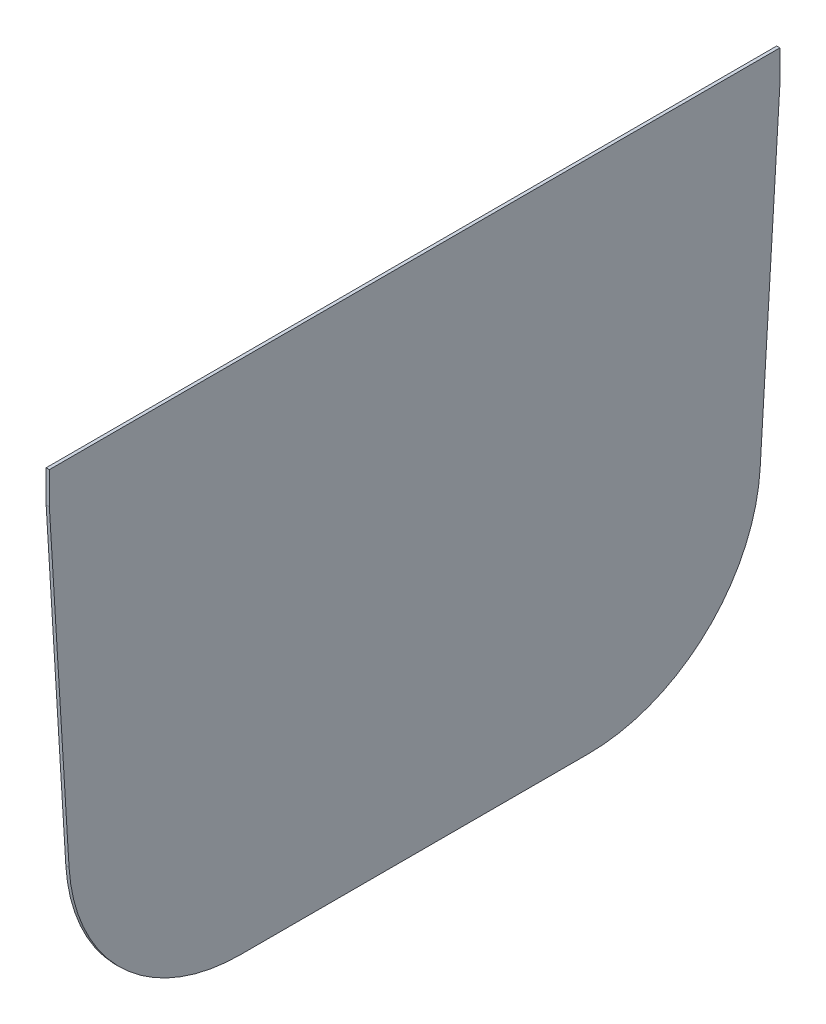
ISO-10303-21;
HEADER;
FILE_DESCRIPTION(('STEP AP214'),'2;1');
FILE_NAME('part.step','',(''),(''),'','','');
FILE_SCHEMA(('AUTOMOTIVE_DESIGN { 1 0 10303 214 1 1 1 1 }'));
ENDSEC;
DATA;
#1=APPLICATION_CONTEXT('core data for automotive mechanical design processes');
#2=APPLICATION_PROTOCOL_DEFINITION('international standard','automotive_design',2000,#1);
#3=PRODUCT_CONTEXT('',#1,'mechanical');
#4=PRODUCT('Part','Part','',(#3));
#5=PRODUCT_RELATED_PRODUCT_CATEGORY('part','',(#4));
#6=PRODUCT_DEFINITION_FORMATION('','',#4);
#7=PRODUCT_DEFINITION_CONTEXT('part definition',#1,'design');
#8=PRODUCT_DEFINITION('design','',#6,#7);
#9=PRODUCT_DEFINITION_SHAPE('','',#8);
#10=(LENGTH_UNIT() NAMED_UNIT(*) SI_UNIT(.MILLI.,.METRE.));
#11=(NAMED_UNIT(*) PLANE_ANGLE_UNIT() SI_UNIT($,.RADIAN.));
#12=(NAMED_UNIT(*) SI_UNIT($,.STERADIAN.) SOLID_ANGLE_UNIT());
#13=UNCERTAINTY_MEASURE_WITH_UNIT(LENGTH_MEASURE(1.E-05),#10,'distance_accuracy_value','');
#14=(GEOMETRIC_REPRESENTATION_CONTEXT(3) GLOBAL_UNCERTAINTY_ASSIGNED_CONTEXT((#13)) GLOBAL_UNIT_ASSIGNED_CONTEXT((#10,
#11,#12)) REPRESENTATION_CONTEXT('',''));
#15=CARTESIAN_POINT('',(0.,0.,0.));
#16=DIRECTION('',(0.,0.,1.));
#17=DIRECTION('',(1.,0.,0.));
#18=AXIS2_PLACEMENT_3D('',#15,#16,#17);
#19=CARTESIAN_POINT('',(1.5,-149.998844119243,-109.248974344511));
#20=DIRECTION('',(-1.,0.,0.));
#21=DIRECTION('',(0.,0.,1.));
#22=AXIS2_PLACEMENT_3D('',#19,#20,#21);
#23=CYLINDRICAL_SURFACE('',#22,80.);
#24=CARTESIAN_POINT('',(0.,-149.998844119243,-109.248974344511));
#25=DIRECTION('',(1.,0.,0.));
#26=DIRECTION('',(0.,0.,-1.));
#27=AXIS2_PLACEMENT_3D('',#24,#25,#26);
#28=CIRCLE('',#27,80.);
#29=CARTESIAN_POINT('',(0.,-154.882727282031,-29.3981904707621));
#30=VERTEX_POINT('',#29);
#31=CARTESIAN_POINT('',(0.,-229.998844119243,-109.248974344511));
#32=VERTEX_POINT('',#31);
#33=EDGE_CURVE('E204',#30,#32,#28,.T.);
#34=ORIENTED_EDGE('',*,*,#33,.T.);
#35=DIRECTION('',(-1.,0.,0.));
#36=VECTOR('',#35,1.);
#37=CARTESIAN_POINT('',(1.5,-229.998844119243,-109.248974344511));
#38=LINE('',#37,#36);
#39=CARTESIAN_POINT('',(1.5,-229.998844119243,-109.248974344511));
#40=VERTEX_POINT('',#39);
#41=EDGE_CURVE('E14',#40,#32,#38,.T.);
#42=ORIENTED_EDGE('',*,*,#41,.F.);
#43=CARTESIAN_POINT('',(1.5,-149.998844119243,-109.248974344511));
#44=DIRECTION('',(1.,0.,0.));
#45=DIRECTION('',(0.,0.,-1.));
#46=AXIS2_PLACEMENT_3D('',#43,#44,#45);
#47=CIRCLE('',#46,80.);
#48=CARTESIAN_POINT('',(1.5,-154.882727282031,-29.3981904707621));
#49=VERTEX_POINT('',#48);
#50=EDGE_CURVE('E218',#49,#40,#47,.T.);
#51=ORIENTED_EDGE('',*,*,#50,.F.);
#52=DIRECTION('',(-1.,0.,0.));
#53=VECTOR('',#52,1.);
#54=CARTESIAN_POINT('',(1.5,-154.882727282031,-29.3981904707621));
#55=LINE('',#54,#53);
#56=EDGE_CURVE('E200',#49,#30,#55,.T.);
#57=ORIENTED_EDGE('',*,*,#56,.T.);
#58=EDGE_LOOP('',(#34,#42,#51,#57));
#59=FACE_BOUND('',#58,.T.);
#60=ADVANCED_FACE('F108',(#59),#23,.T.);
#61=CARTESIAN_POINT('',(1.5,-229.998844119243,-109.248974344511));
#62=DIRECTION('',(0.,1.,0.));
#63=DIRECTION('',(0.,0.,1.));
#64=AXIS2_PLACEMENT_3D('',#61,#62,#63);
#65=PLANE('',#64);
#66=DIRECTION('',(0.,0.,-1.));
#67=VECTOR('',#66,1.);
#68=CARTESIAN_POINT('',(0.,-229.998844119243,-109.248974344511));
#69=LINE('',#68,#67);
#70=CARTESIAN_POINT('',(0.,-229.998844119243,-271.212824571882));
#71=VERTEX_POINT('',#70);
#72=EDGE_CURVE('E207',#32,#71,#69,.T.);
#73=ORIENTED_EDGE('',*,*,#72,.T.);
#74=DIRECTION('',(-1.,0.,0.));
#75=VECTOR('',#74,1.);
#76=CARTESIAN_POINT('',(1.5,-229.998844119243,-271.212824571882));
#77=LINE('',#76,#75);
#78=CARTESIAN_POINT('',(1.5,-229.998844119243,-271.212824571882));
#79=VERTEX_POINT('',#78);
#80=EDGE_CURVE('E116',#79,#71,#77,.T.);
#81=ORIENTED_EDGE('',*,*,#80,.F.);
#82=DIRECTION('',(0.,0.,-1.));
#83=VECTOR('',#82,1.);
#84=CARTESIAN_POINT('',(1.5,-229.998844119243,-109.248974344511));
#85=LINE('',#84,#83);
#86=EDGE_CURVE('E167',#40,#79,#85,.T.);
#87=ORIENTED_EDGE('',*,*,#86,.F.);
#88=ORIENTED_EDGE('',*,*,#41,.T.);
#89=EDGE_LOOP('',(#73,#81,#87,#88));
#90=FACE_BOUND('',#89,.T.);
#91=ADVANCED_FACE('F253',(#90),#65,.F.);
#92=CARTESIAN_POINT('',(1.5,-149.998844119243,-271.212824571882));
#93=DIRECTION('',(-1.,0.,0.));
#94=DIRECTION('',(0.,0.,1.));
#95=AXIS2_PLACEMENT_3D('',#92,#93,#94);
#96=CYLINDRICAL_SURFACE('',#95,80.);
#97=CARTESIAN_POINT('',(0.,-149.998844119243,-271.212824571882));
#98=DIRECTION('',(1.,0.,0.));
#99=DIRECTION('',(0.,0.,1.));
#100=AXIS2_PLACEMENT_3D('',#97,#98,#99);
#101=CIRCLE('',#100,80.);
#102=CARTESIAN_POINT('',(0.,-154.882727282031,-351.063608445632));
#103=VERTEX_POINT('',#102);
#104=EDGE_CURVE('E209',#71,#103,#101,.T.);
#105=ORIENTED_EDGE('',*,*,#104,.T.);
#106=DIRECTION('',(-1.,0.,0.));
#107=VECTOR('',#106,1.);
#108=CARTESIAN_POINT('',(1.5,-154.882727282031,-351.063608445632));
#109=LINE('',#108,#107);
#110=CARTESIAN_POINT('',(1.5,-154.882727282031,-351.063608445632));
#111=VERTEX_POINT('',#110);
#112=EDGE_CURVE('E225',#111,#103,#109,.T.);
#113=ORIENTED_EDGE('',*,*,#112,.F.);
#114=CARTESIAN_POINT('',(1.5,-149.998844119243,-271.212824571882));
#115=DIRECTION('',(1.,0.,0.));
#116=DIRECTION('',(0.,0.,1.));
#117=AXIS2_PLACEMENT_3D('',#114,#115,#116);
#118=CIRCLE('',#117,80.);
#119=EDGE_CURVE('E233',#79,#111,#118,.T.);
#120=ORIENTED_EDGE('',*,*,#119,.F.);
#121=ORIENTED_EDGE('',*,*,#80,.T.);
#122=EDGE_LOOP('',(#105,#113,#120,#121));
#123=FACE_BOUND('',#122,.T.);
#124=ADVANCED_FACE('F231',(#123),#96,.T.);
#125=CARTESIAN_POINT('',(1.5,-4.99884411924286,-360.230899458197));
#126=DIRECTION('',(0.,0.0610485395348575,0.998134798421867));
#127=DIRECTION('',(0.,-0.998134798421867,0.0610485395348575));
#128=AXIS2_PLACEMENT_3D('',#125,#126,#127);
#129=PLANE('',#128);
#130=DIRECTION('',(0.,0.998134798421867,-0.0610485395348575));
#131=VECTOR('',#130,1.);
#132=CARTESIAN_POINT('',(0.,-4.99884411924286,-360.230899458197));
#133=LINE('',#132,#131);
#134=CARTESIAN_POINT('',(0.,-4.99884411924286,-360.230899458197));
#135=VERTEX_POINT('',#134);
#136=EDGE_CURVE('E211',#103,#135,#133,.T.);
#137=ORIENTED_EDGE('',*,*,#136,.T.);
#138=DIRECTION('',(-1.,0.,0.));
#139=VECTOR('',#138,1.);
#140=CARTESIAN_POINT('',(1.5,-4.99884411924286,-360.230899458197));
#141=LINE('',#140,#139);
#142=CARTESIAN_POINT('',(1.5,-4.99884411924286,-360.230899458197));
#143=VERTEX_POINT('',#142);
#144=EDGE_CURVE('E222',#143,#135,#141,.T.);
#145=ORIENTED_EDGE('',*,*,#144,.F.);
#146=DIRECTION('',(0.,0.998134798421867,-0.0610485395348575));
#147=VECTOR('',#146,1.);
#148=CARTESIAN_POINT('',(1.5,-4.99884411924286,-360.230899458197));
#149=LINE('',#148,#147);
#150=EDGE_CURVE('E245',#111,#143,#149,.T.);
#151=ORIENTED_EDGE('',*,*,#150,.F.);
#152=ORIENTED_EDGE('',*,*,#112,.T.);
#153=EDGE_LOOP('',(#137,#145,#151,#152));
#154=FACE_BOUND('',#153,.T.);
#155=ADVANCED_FACE('F241',(#154),#129,.F.);
#156=CARTESIAN_POINT('',(1.5,10.0011558807571,-360.230899458197));
#157=DIRECTION('',(0.,0.,1.));
#158=DIRECTION('',(1.,0.,0.));
#159=AXIS2_PLACEMENT_3D('',#156,#157,#158);
#160=PLANE('',#159);
#161=DIRECTION('',(0.,1.,0.));
#162=VECTOR('',#161,1.);
#163=CARTESIAN_POINT('',(0.,10.0011558807571,-360.230899458197));
#164=LINE('',#163,#162);
#165=CARTESIAN_POINT('',(0.,10.0011558807571,-360.230899458197));
#166=VERTEX_POINT('',#165);
#167=EDGE_CURVE('E213',#135,#166,#164,.T.);
#168=ORIENTED_EDGE('',*,*,#167,.T.);
#169=DIRECTION('',(-1.,0.,0.));
#170=VECTOR('',#169,1.);
#171=CARTESIAN_POINT('',(1.5,10.0011558807571,-360.230899458197));
#172=LINE('',#171,#170);
#173=CARTESIAN_POINT('',(1.5,10.0011558807571,-360.230899458197));
#174=VERTEX_POINT('',#173);
#175=EDGE_CURVE('E195',#174,#166,#172,.T.);
#176=ORIENTED_EDGE('',*,*,#175,.F.);
#177=DIRECTION('',(0.,1.,0.));
#178=VECTOR('',#177,1.);
#179=CARTESIAN_POINT('',(1.5,10.0011558807571,-360.230899458197));
#180=LINE('',#179,#178);
#181=EDGE_CURVE('E186',#143,#174,#180,.T.);
#182=ORIENTED_EDGE('',*,*,#181,.F.);
#183=ORIENTED_EDGE('',*,*,#144,.T.);
#184=EDGE_LOOP('',(#168,#176,#182,#183));
#185=FACE_BOUND('',#184,.T.);
#186=ADVANCED_FACE('F244',(#185),#160,.F.);
#187=CARTESIAN_POINT('',(1.5,10.0011558807571,-20.2308994581968));
#188=DIRECTION('',(0.,-1.,0.));
#189=DIRECTION('',(0.,0.,-1.));
#190=AXIS2_PLACEMENT_3D('',#187,#188,#189);
#191=PLANE('',#190);
#192=DIRECTION('',(0.,0.,1.));
#193=VECTOR('',#192,1.);
#194=CARTESIAN_POINT('',(0.,10.0011558807571,-20.2308994581968));
#195=LINE('',#194,#193);
#196=CARTESIAN_POINT('',(0.,10.0011558807571,-20.2308994581968));
#197=VERTEX_POINT('',#196);
#198=EDGE_CURVE('E194',#166,#197,#195,.T.);
#199=ORIENTED_EDGE('',*,*,#198,.T.);
#200=DIRECTION('',(-1.,0.,0.));
#201=VECTOR('',#200,1.);
#202=CARTESIAN_POINT('',(1.5,10.0011558807571,-20.2308994581968));
#203=LINE('',#202,#201);
#204=CARTESIAN_POINT('',(1.5,10.0011558807571,-20.2308994581968));
#205=VERTEX_POINT('',#204);
#206=EDGE_CURVE('E191',#205,#197,#203,.T.);
#207=ORIENTED_EDGE('',*,*,#206,.F.);
#208=DIRECTION('',(0.,0.,1.));
#209=VECTOR('',#208,1.);
#210=CARTESIAN_POINT('',(1.5,10.0011558807571,-20.2308994581968));
#211=LINE('',#210,#209);
#212=EDGE_CURVE('E180',#174,#205,#211,.T.);
#213=ORIENTED_EDGE('',*,*,#212,.F.);
#214=ORIENTED_EDGE('',*,*,#175,.T.);
#215=EDGE_LOOP('',(#199,#207,#213,#214));
#216=FACE_BOUND('',#215,.T.);
#217=ADVANCED_FACE('F192',(#216),#191,.F.);
#218=CARTESIAN_POINT('',(1.5,10.0011558807571,-20.2308994581968));
#219=DIRECTION('',(0.,0.,-1.));
#220=DIRECTION('',(0.,1.,0.));
#221=AXIS2_PLACEMENT_3D('',#218,#219,#220);
#222=PLANE('',#221);
#223=DIRECTION('',(0.,-1.,0.));
#224=VECTOR('',#223,1.);
#225=CARTESIAN_POINT('',(0.,10.0011558807571,-20.2308994581968));
#226=LINE('',#225,#224);
#227=CARTESIAN_POINT('',(0.,-4.99884411924286,-20.2308994581968));
#228=VERTEX_POINT('',#227);
#229=EDGE_CURVE('E153',#197,#228,#226,.T.);
#230=ORIENTED_EDGE('',*,*,#229,.T.);
#231=DIRECTION('',(-1.,0.,0.));
#232=VECTOR('',#231,1.);
#233=CARTESIAN_POINT('',(1.5,-4.99884411924286,-20.2308994581968));
#234=LINE('',#233,#232);
#235=CARTESIAN_POINT('',(1.5,-4.99884411924286,-20.2308994581968));
#236=VERTEX_POINT('',#235);
#237=EDGE_CURVE('E196',#236,#228,#234,.T.);
#238=ORIENTED_EDGE('',*,*,#237,.F.);
#239=DIRECTION('',(0.,-1.,0.));
#240=VECTOR('',#239,1.);
#241=CARTESIAN_POINT('',(1.5,10.0011558807571,-20.2308994581968));
#242=LINE('',#241,#240);
#243=EDGE_CURVE('E184',#205,#236,#242,.T.);
#244=ORIENTED_EDGE('',*,*,#243,.F.);
#245=ORIENTED_EDGE('',*,*,#206,.T.);
#246=EDGE_LOOP('',(#230,#238,#244,#245));
#247=FACE_BOUND('',#246,.T.);
#248=ADVANCED_FACE('F198',(#247),#222,.F.);
#249=CARTESIAN_POINT('',(1.5,-4.99884411924286,-20.2308994581968));
#250=DIRECTION('',(0.,0.0610485395348575,-0.998134798421867));
#251=DIRECTION('',(0.,0.998134798421867,0.0610485395348575));
#252=AXIS2_PLACEMENT_3D('',#249,#250,#251);
#253=PLANE('',#252);
#254=DIRECTION('',(0.,-0.998134798421867,-0.0610485395348575));
#255=VECTOR('',#254,1.);
#256=CARTESIAN_POINT('',(0.,-4.99884411924286,-20.2308994581968));
#257=LINE('',#256,#255);
#258=EDGE_CURVE('E159',#228,#30,#257,.T.);
#259=ORIENTED_EDGE('',*,*,#258,.T.);
#260=ORIENTED_EDGE('',*,*,#56,.F.);
#261=DIRECTION('',(0.,-0.998134798421867,-0.0610485395348575));
#262=VECTOR('',#261,1.);
#263=CARTESIAN_POINT('',(1.5,-4.99884411924286,-20.2308994581968));
#264=LINE('',#263,#262);
#265=EDGE_CURVE('E124',#236,#49,#264,.T.);
#266=ORIENTED_EDGE('',*,*,#265,.F.);
#267=ORIENTED_EDGE('',*,*,#237,.T.);
#268=EDGE_LOOP('',(#259,#260,#266,#267));
#269=FACE_BOUND('',#268,.T.);
#270=ADVANCED_FACE('F269',(#269),#253,.F.);
#271=CARTESIAN_POINT('',(1.5,-149.998844119243,-109.248974344511));
#272=DIRECTION('',(1.,0.,0.));
#273=DIRECTION('',(0.,0.,-1.));
#274=AXIS2_PLACEMENT_3D('',#271,#272,#273);
#275=PLANE('',#274);
#276=ORIENTED_EDGE('',*,*,#50,.T.);
#277=ORIENTED_EDGE('',*,*,#86,.T.);
#278=ORIENTED_EDGE('',*,*,#119,.T.);
#279=ORIENTED_EDGE('',*,*,#150,.T.);
#280=ORIENTED_EDGE('',*,*,#181,.T.);
#281=ORIENTED_EDGE('',*,*,#212,.T.);
#282=ORIENTED_EDGE('',*,*,#243,.T.);
#283=ORIENTED_EDGE('',*,*,#265,.T.);
#284=EDGE_LOOP('',(#276,#277,#278,#279,#280,#281,#282,#283));
#285=FACE_BOUND('',#284,.T.);
#286=ADVANCED_FACE('F182',(#285),#275,.T.);
#287=CARTESIAN_POINT('',(0.,-149.998844119243,-109.248974344511));
#288=DIRECTION('',(1.,0.,0.));
#289=DIRECTION('',(0.,0.,-1.));
#290=AXIS2_PLACEMENT_3D('',#287,#288,#289);
#291=PLANE('',#290);
#292=ORIENTED_EDGE('',*,*,#33,.F.);
#293=ORIENTED_EDGE('',*,*,#258,.F.);
#294=ORIENTED_EDGE('',*,*,#229,.F.);
#295=ORIENTED_EDGE('',*,*,#198,.F.);
#296=ORIENTED_EDGE('',*,*,#167,.F.);
#297=ORIENTED_EDGE('',*,*,#136,.F.);
#298=ORIENTED_EDGE('',*,*,#104,.F.);
#299=ORIENTED_EDGE('',*,*,#72,.F.);
#300=EDGE_LOOP('',(#292,#293,#294,#295,#296,#297,#298,#299));
#301=FACE_BOUND('',#300,.T.);
#302=ADVANCED_FACE('F237',(#301),#291,.F.);
#303=CLOSED_SHELL('',(#60,#91,#124,#155,#186,#217,#248,#270,#286,#302));
#304=MANIFOLD_SOLID_BREP('B2',#303);
#305=ADVANCED_BREP_SHAPE_REPRESENTATION('',(#18,#304),#14);
#306=SHAPE_DEFINITION_REPRESENTATION(#9,#305);
ENDSEC;
END-ISO-10303-21;
